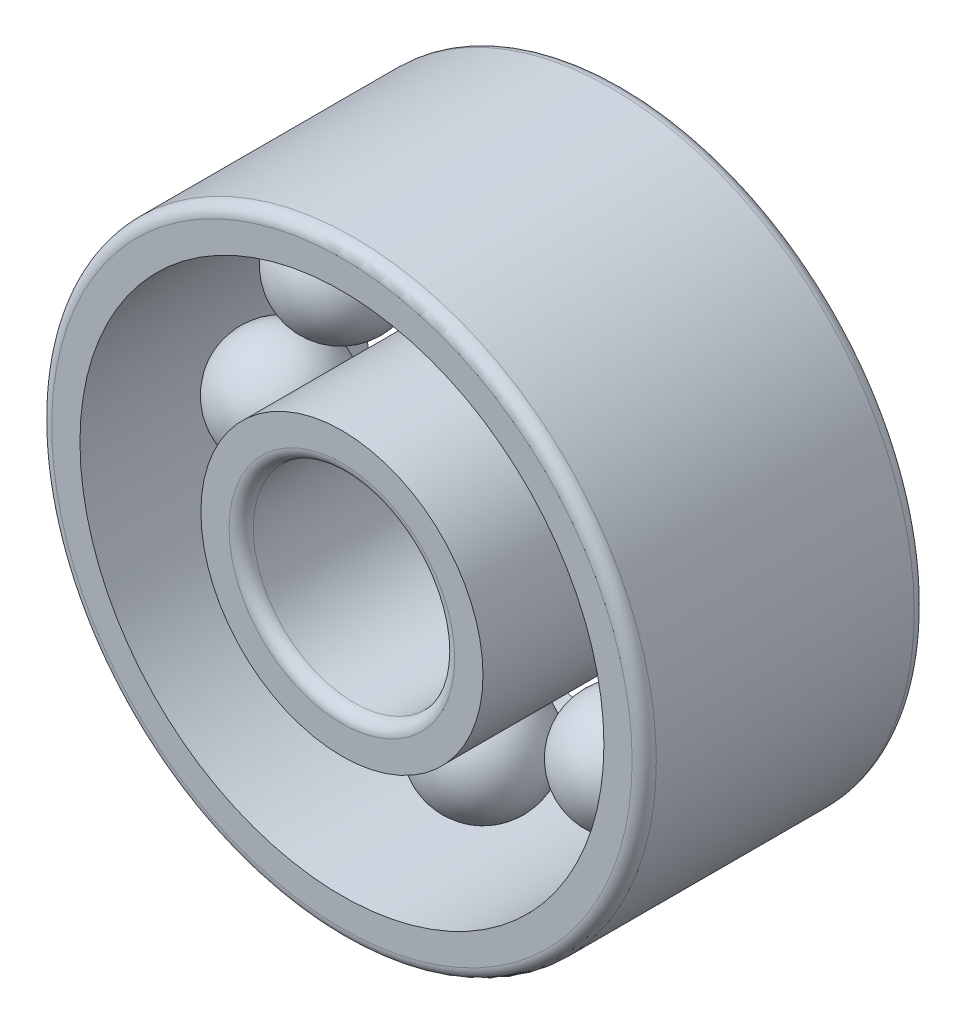
ISO-10303-21;
HEADER;
FILE_DESCRIPTION(('STEP AP214'),'2;1');
FILE_NAME('part.step','',(''),(''),'','','');
FILE_SCHEMA(('AUTOMOTIVE_DESIGN { 1 0 10303 214 1 1 1 1 }'));
ENDSEC;
DATA;
#1=APPLICATION_CONTEXT('core data for automotive mechanical design processes');
#2=APPLICATION_PROTOCOL_DEFINITION('international standard','automotive_design',2000,#1);
#3=PRODUCT_CONTEXT('',#1,'mechanical');
#4=PRODUCT('Part','Part','',(#3));
#5=PRODUCT_RELATED_PRODUCT_CATEGORY('part','',(#4));
#6=PRODUCT_DEFINITION_FORMATION('','',#4);
#7=PRODUCT_DEFINITION_CONTEXT('part definition',#1,'design');
#8=PRODUCT_DEFINITION('design','',#6,#7);
#9=PRODUCT_DEFINITION_SHAPE('','',#8);
#10=(LENGTH_UNIT() NAMED_UNIT(*) SI_UNIT(.MILLI.,.METRE.));
#11=(NAMED_UNIT(*) PLANE_ANGLE_UNIT() SI_UNIT($,.RADIAN.));
#12=(NAMED_UNIT(*) SI_UNIT($,.STERADIAN.) SOLID_ANGLE_UNIT());
#13=UNCERTAINTY_MEASURE_WITH_UNIT(LENGTH_MEASURE(1.E-05),#10,'distance_accuracy_value','');
#14=(GEOMETRIC_REPRESENTATION_CONTEXT(3) GLOBAL_UNCERTAINTY_ASSIGNED_CONTEXT((#13)) GLOBAL_UNIT_ASSIGNED_CONTEXT((#10,
#11,#12)) REPRESENTATION_CONTEXT('',''));
#15=CARTESIAN_POINT('',(0.,0.,0.));
#16=DIRECTION('',(0.,0.,1.));
#17=DIRECTION('',(1.,0.,0.));
#18=AXIS2_PLACEMENT_3D('',#15,#16,#17);
#19=CARTESIAN_POINT('',(7.07106781186547,-7.07106781186548,0.));
#20=DIRECTION('',(-0.707106781186547,0.707106781186548,0.));
#21=DIRECTION('',(0.,0.,-1.));
#22=AXIS2_PLACEMENT_3D('',#19,#20,#21);
#23=SPHERICAL_SURFACE('',#22,2.85);
#24=CARTESIAN_POINT('',(5.05581348548381,-5.05581348548382,0.));
#25=VERTEX_POINT('',#24);
#26=VERTEX_LOOP('',#25);
#27=FACE_BOUND('',#26,.T.);
#28=ADVANCED_FACE('F38',(#27),#23,.T.);
#29=CLOSED_SHELL('',(#28));
#30=MANIFOLD_SOLID_BREP('B2',#29);
#31=CARTESIAN_POINT('',(0.,-10.,0.));
#32=DIRECTION('',(0.,1.,0.));
#33=DIRECTION('',(0.,0.,-1.));
#34=AXIS2_PLACEMENT_3D('',#31,#32,#33);
#35=SPHERICAL_SURFACE('',#34,2.85);
#36=CARTESIAN_POINT('',(0.,-7.15,0.));
#37=VERTEX_POINT('',#36);
#38=VERTEX_LOOP('',#37);
#39=FACE_BOUND('',#38,.T.);
#40=ADVANCED_FACE('F57',(#39),#35,.T.);
#41=CLOSED_SHELL('',(#40));
#42=MANIFOLD_SOLID_BREP('B6',#41);
#43=CARTESIAN_POINT('',(-7.07106781186548,-7.07106781186547,0.));
#44=DIRECTION('',(0.707106781186548,0.707106781186547,0.));
#45=DIRECTION('',(0.,0.,-1.));
#46=AXIS2_PLACEMENT_3D('',#43,#44,#45);
#47=SPHERICAL_SURFACE('',#46,2.85);
#48=CARTESIAN_POINT('',(-5.05581348548382,-5.05581348548381,0.));
#49=VERTEX_POINT('',#48);
#50=VERTEX_LOOP('',#49);
#51=FACE_BOUND('',#50,.T.);
#52=ADVANCED_FACE('F76',(#51),#47,.T.);
#53=CLOSED_SHELL('',(#52));
#54=MANIFOLD_SOLID_BREP('B34',#53);
#55=CARTESIAN_POINT('',(-10.,0.,0.));
#56=DIRECTION('',(1.,0.,0.));
#57=DIRECTION('',(0.,0.,-1.));
#58=AXIS2_PLACEMENT_3D('',#55,#56,#57);
#59=SPHERICAL_SURFACE('',#58,2.85);
#60=CARTESIAN_POINT('',(-7.15,0.,0.));
#61=VERTEX_POINT('',#60);
#62=VERTEX_LOOP('',#61);
#63=FACE_BOUND('',#62,.T.);
#64=ADVANCED_FACE('F95',(#63),#59,.T.);
#65=CLOSED_SHELL('',(#64));
#66=MANIFOLD_SOLID_BREP('B53',#65);
#67=CARTESIAN_POINT('',(-7.07106781186547,7.07106781186548,0.));
#68=DIRECTION('',(0.707106781186547,-0.707106781186548,0.));
#69=DIRECTION('',(0.,0.,-1.));
#70=AXIS2_PLACEMENT_3D('',#67,#68,#69);
#71=SPHERICAL_SURFACE('',#70,2.85);
#72=CARTESIAN_POINT('',(-5.05581348548381,5.05581348548382,0.));
#73=VERTEX_POINT('',#72);
#74=VERTEX_LOOP('',#73);
#75=FACE_BOUND('',#74,.T.);
#76=ADVANCED_FACE('F114',(#75),#71,.T.);
#77=CLOSED_SHELL('',(#76));
#78=MANIFOLD_SOLID_BREP('B72',#77);
#79=CARTESIAN_POINT('',(0.,10.,0.));
#80=DIRECTION('',(0.,-1.,0.));
#81=DIRECTION('',(0.,0.,-1.));
#82=AXIS2_PLACEMENT_3D('',#79,#80,#81);
#83=SPHERICAL_SURFACE('',#82,2.85);
#84=CARTESIAN_POINT('',(0.,7.15,0.));
#85=VERTEX_POINT('',#84);
#86=VERTEX_LOOP('',#85);
#87=FACE_BOUND('',#86,.T.);
#88=ADVANCED_FACE('F133',(#87),#83,.T.);
#89=CLOSED_SHELL('',(#88));
#90=MANIFOLD_SOLID_BREP('B91',#89);
#91=CARTESIAN_POINT('',(7.07106781186548,7.07106781186548,0.));
#92=DIRECTION('',(-0.707106781186548,-0.707106781186548,0.));
#93=DIRECTION('',(0.,0.,-1.));
#94=AXIS2_PLACEMENT_3D('',#91,#92,#93);
#95=SPHERICAL_SURFACE('',#94,2.85);
#96=CARTESIAN_POINT('',(5.05581348548382,5.05581348548382,0.));
#97=VERTEX_POINT('',#96);
#98=VERTEX_LOOP('',#97);
#99=FACE_BOUND('',#98,.T.);
#100=ADVANCED_FACE('F152',(#99),#95,.T.);
#101=CLOSED_SHELL('',(#100));
#102=MANIFOLD_SOLID_BREP('B110',#101);
#103=CARTESIAN_POINT('',(10.,0.,0.));
#104=DIRECTION('',(-1.,0.,0.));
#105=DIRECTION('',(0.,0.,-1.));
#106=AXIS2_PLACEMENT_3D('',#103,#104,#105);
#107=SPHERICAL_SURFACE('',#106,2.85);
#108=CARTESIAN_POINT('',(7.15,0.,0.));
#109=VERTEX_POINT('',#108);
#110=VERTEX_LOOP('',#109);
#111=FACE_BOUND('',#110,.T.);
#112=ADVANCED_FACE('F173',(#111),#107,.T.);
#113=CLOSED_SHELL('',(#112));
#114=MANIFOLD_SOLID_BREP('B129',#113);
#115=CARTESIAN_POINT('',(0.,0.,11.5));
#116=DIRECTION('',(0.,0.,1.));
#117=DIRECTION('',(1.,0.,0.));
#118=AXIS2_PLACEMENT_3D('',#115,#116,#117);
#119=CYLINDRICAL_SURFACE('',#118,13.);
#120=CARTESIAN_POINT('',(0.,0.,7.));
#121=DIRECTION('',(0.,0.,1.));
#122=DIRECTION('',(1.,0.,0.));
#123=AXIS2_PLACEMENT_3D('',#120,#121,#122);
#124=CIRCLE('',#123,13.);
#125=CARTESIAN_POINT('',(13.,0.,7.));
#126=VERTEX_POINT('',#125);
#127=EDGE_CURVE('E213',#126,#126,#124,.T.);
#128=ORIENTED_EDGE('',*,*,#127,.T.);
#129=EDGE_LOOP('',(#128));
#130=FACE_BOUND('',#129,.T.);
#131=CARTESIAN_POINT('',(0.,0.,-7.));
#132=DIRECTION('',(0.,0.,1.));
#133=DIRECTION('',(1.,0.,0.));
#134=AXIS2_PLACEMENT_3D('',#131,#132,#133);
#135=CIRCLE('',#134,13.);
#136=CARTESIAN_POINT('',(13.,0.,-7.));
#137=VERTEX_POINT('',#136);
#138=EDGE_CURVE('E216',#137,#137,#135,.T.);
#139=ORIENTED_EDGE('',*,*,#138,.F.);
#140=EDGE_LOOP('',(#139));
#141=FACE_BOUND('',#140,.T.);
#142=ADVANCED_FACE('F193',(#130,#141),#119,.F.);
#143=CARTESIAN_POINT('',(13.,0.,7.));
#144=DIRECTION('',(0.,0.,1.));
#145=DIRECTION('',(1.,0.,0.));
#146=AXIS2_PLACEMENT_3D('',#143,#144,#145);
#147=PLANE('',#146);
#148=CARTESIAN_POINT('',(0.,0.,7.));
#149=DIRECTION('',(0.,0.,1.));
#150=DIRECTION('',(1.,0.,0.));
#151=AXIS2_PLACEMENT_3D('',#148,#149,#150);
#152=CIRCLE('',#151,14.4);
#153=CARTESIAN_POINT('',(14.4,0.,7.));
#154=VERTEX_POINT('',#153);
#155=EDGE_CURVE('E172',#154,#154,#152,.T.);
#156=ORIENTED_EDGE('',*,*,#155,.T.);
#157=EDGE_LOOP('',(#156));
#158=FACE_BOUND('',#157,.T.);
#159=ORIENTED_EDGE('',*,*,#127,.F.);
#160=EDGE_LOOP('',(#159));
#161=FACE_BOUND('',#160,.T.);
#162=ADVANCED_FACE('F223',(#158,#161),#147,.T.);
#163=CARTESIAN_POINT('',(0.,0.,11.5));
#164=DIRECTION('',(0.,0.,1.));
#165=DIRECTION('',(1.,0.,0.));
#166=AXIS2_PLACEMENT_3D('',#163,#164,#165);
#167=CYLINDRICAL_SURFACE('',#166,15.);
#168=CARTESIAN_POINT('',(0.,0.,-6.4));
#169=DIRECTION('',(0.,0.,-1.));
#170=DIRECTION('',(-1.,0.,0.));
#171=AXIS2_PLACEMENT_3D('',#168,#169,#170);
#172=CIRCLE('',#171,15.);
#173=CARTESIAN_POINT('',(-15.,0.,-6.4));
#174=VERTEX_POINT('',#173);
#175=EDGE_CURVE('E204',#174,#174,#172,.F.);
#176=ORIENTED_EDGE('',*,*,#175,.T.);
#177=EDGE_LOOP('',(#176));
#178=FACE_BOUND('',#177,.T.);
#179=CARTESIAN_POINT('',(0.,0.,6.4));
#180=DIRECTION('',(0.,0.,1.));
#181=DIRECTION('',(1.,0.,0.));
#182=AXIS2_PLACEMENT_3D('',#179,#180,#181);
#183=CIRCLE('',#182,15.);
#184=CARTESIAN_POINT('',(15.,0.,6.4));
#185=VERTEX_POINT('',#184);
#186=EDGE_CURVE('E208',#185,#185,#183,.F.);
#187=ORIENTED_EDGE('',*,*,#186,.T.);
#188=EDGE_LOOP('',(#187));
#189=FACE_BOUND('',#188,.T.);
#190=ADVANCED_FACE('F229',(#178,#189),#167,.T.);
#191=CARTESIAN_POINT('',(15.,0.,-7.));
#192=DIRECTION('',(0.,0.,-1.));
#193=DIRECTION('',(-1.,0.,0.));
#194=AXIS2_PLACEMENT_3D('',#191,#192,#193);
#195=PLANE('',#194);
#196=CARTESIAN_POINT('',(0.,0.,-7.));
#197=DIRECTION('',(0.,0.,-1.));
#198=DIRECTION('',(-1.,0.,0.));
#199=AXIS2_PLACEMENT_3D('',#196,#197,#198);
#200=CIRCLE('',#199,14.4);
#201=CARTESIAN_POINT('',(-14.4,0.,-7.));
#202=VERTEX_POINT('',#201);
#203=EDGE_CURVE('E200',#202,#202,#200,.T.);
#204=ORIENTED_EDGE('',*,*,#203,.T.);
#205=EDGE_LOOP('',(#204));
#206=FACE_BOUND('',#205,.T.);
#207=ORIENTED_EDGE('',*,*,#138,.T.);
#208=EDGE_LOOP('',(#207));
#209=FACE_BOUND('',#208,.T.);
#210=ADVANCED_FACE('F220',(#206,#209),#195,.T.);
#211=CARTESIAN_POINT('',(0.,0.,-6.4));
#212=DIRECTION('',(0.,0.,-1.));
#213=DIRECTION('',(-1.,0.,0.));
#214=AXIS2_PLACEMENT_3D('',#211,#212,#213);
#215=TOROIDAL_SURFACE('',#214,14.4,0.6);
#216=ORIENTED_EDGE('',*,*,#203,.F.);
#217=EDGE_LOOP('',(#216));
#218=FACE_BOUND('',#217,.T.);
#219=ORIENTED_EDGE('',*,*,#175,.F.);
#220=EDGE_LOOP('',(#219));
#221=FACE_BOUND('',#220,.T.);
#222=ADVANCED_FACE('F232',(#218,#221),#215,.T.);
#223=CARTESIAN_POINT('',(0.,0.,6.4));
#224=DIRECTION('',(0.,0.,1.));
#225=DIRECTION('',(1.,0.,0.));
#226=AXIS2_PLACEMENT_3D('',#223,#224,#225);
#227=TOROIDAL_SURFACE('',#226,14.4,0.6);
#228=ORIENTED_EDGE('',*,*,#186,.F.);
#229=EDGE_LOOP('',(#228));
#230=FACE_BOUND('',#229,.T.);
#231=ORIENTED_EDGE('',*,*,#155,.F.);
#232=EDGE_LOOP('',(#231));
#233=FACE_BOUND('',#232,.T.);
#234=ADVANCED_FACE('F195',(#230,#233),#227,.T.);
#235=CLOSED_SHELL('',(#142,#162,#190,#210,#222,#234));
#236=MANIFOLD_SOLID_BREP('B148',#235);
#237=CARTESIAN_POINT('',(0.,0.,11.5));
#238=DIRECTION('',(0.,0.,1.));
#239=DIRECTION('',(1.,0.,0.));
#240=AXIS2_PLACEMENT_3D('',#237,#238,#239);
#241=CYLINDRICAL_SURFACE('',#240,5.);
#242=CARTESIAN_POINT('',(0.,0.,-6.4));
#243=DIRECTION('',(0.,0.,-1.));
#244=DIRECTION('',(-1.,0.,0.));
#245=AXIS2_PLACEMENT_3D('',#242,#243,#244);
#246=CIRCLE('',#245,5.);
#247=CARTESIAN_POINT('',(-5.,0.,-6.4));
#248=VERTEX_POINT('',#247);
#249=EDGE_CURVE('E292',#248,#248,#246,.T.);
#250=ORIENTED_EDGE('',*,*,#249,.T.);
#251=EDGE_LOOP('',(#250));
#252=FACE_BOUND('',#251,.T.);
#253=CARTESIAN_POINT('',(0.,0.,6.4));
#254=DIRECTION('',(0.,0.,1.));
#255=DIRECTION('',(1.,0.,0.));
#256=AXIS2_PLACEMENT_3D('',#253,#254,#255);
#257=CIRCLE('',#256,5.);
#258=CARTESIAN_POINT('',(5.,0.,6.4));
#259=VERTEX_POINT('',#258);
#260=EDGE_CURVE('E296',#259,#259,#257,.T.);
#261=ORIENTED_EDGE('',*,*,#260,.T.);
#262=EDGE_LOOP('',(#261));
#263=FACE_BOUND('',#262,.T.);
#264=ADVANCED_FACE('F285',(#252,#263),#241,.F.);
#265=CARTESIAN_POINT('',(5.,0.,7.));
#266=DIRECTION('',(0.,0.,1.));
#267=DIRECTION('',(1.,0.,0.));
#268=AXIS2_PLACEMENT_3D('',#265,#266,#267);
#269=PLANE('',#268);
#270=CARTESIAN_POINT('',(0.,0.,7.));
#271=DIRECTION('',(0.,0.,1.));
#272=DIRECTION('',(1.,0.,0.));
#273=AXIS2_PLACEMENT_3D('',#270,#271,#272);
#274=CIRCLE('',#273,5.6);
#275=CARTESIAN_POINT('',(5.6,0.,7.));
#276=VERTEX_POINT('',#275);
#277=EDGE_CURVE('E192',#276,#276,#274,.F.);
#278=ORIENTED_EDGE('',*,*,#277,.T.);
#279=EDGE_LOOP('',(#278));
#280=FACE_BOUND('',#279,.T.);
#281=CARTESIAN_POINT('',(0.,0.,7.));
#282=DIRECTION('',(0.,0.,1.));
#283=DIRECTION('',(1.,0.,0.));
#284=AXIS2_PLACEMENT_3D('',#281,#282,#283);
#285=CIRCLE('',#284,7.);
#286=CARTESIAN_POINT('',(7.,0.,7.));
#287=VERTEX_POINT('',#286);
#288=EDGE_CURVE('E305',#287,#287,#285,.T.);
#289=ORIENTED_EDGE('',*,*,#288,.T.);
#290=EDGE_LOOP('',(#289));
#291=FACE_BOUND('',#290,.T.);
#292=ADVANCED_FACE('F325',(#280,#291),#269,.T.);
#293=CARTESIAN_POINT('',(0.,0.,11.5));
#294=DIRECTION('',(0.,0.,1.));
#295=DIRECTION('',(1.,0.,0.));
#296=AXIS2_PLACEMENT_3D('',#293,#294,#295);
#297=CYLINDRICAL_SURFACE('',#296,7.);
#298=CARTESIAN_POINT('',(0.,0.,-7.));
#299=DIRECTION('',(0.,0.,1.));
#300=DIRECTION('',(1.,0.,0.));
#301=AXIS2_PLACEMENT_3D('',#298,#299,#300);
#302=CIRCLE('',#301,7.);
#303=CARTESIAN_POINT('',(7.,0.,-7.));
#304=VERTEX_POINT('',#303);
#305=EDGE_CURVE('E308',#304,#304,#302,.T.);
#306=ORIENTED_EDGE('',*,*,#305,.T.);
#307=EDGE_LOOP('',(#306));
#308=FACE_BOUND('',#307,.T.);
#309=ORIENTED_EDGE('',*,*,#288,.F.);
#310=EDGE_LOOP('',(#309));
#311=FACE_BOUND('',#310,.T.);
#312=ADVANCED_FACE('F312',(#308,#311),#297,.T.);
#313=CARTESIAN_POINT('',(7.,0.,-7.));
#314=DIRECTION('',(0.,0.,-1.));
#315=DIRECTION('',(-1.,0.,0.));
#316=AXIS2_PLACEMENT_3D('',#313,#314,#315);
#317=PLANE('',#316);
#318=CARTESIAN_POINT('',(0.,0.,-7.));
#319=DIRECTION('',(0.,0.,-1.));
#320=DIRECTION('',(-1.,0.,0.));
#321=AXIS2_PLACEMENT_3D('',#318,#319,#320);
#322=CIRCLE('',#321,5.6);
#323=CARTESIAN_POINT('',(-5.6,0.,-7.));
#324=VERTEX_POINT('',#323);
#325=EDGE_CURVE('E300',#324,#324,#322,.F.);
#326=ORIENTED_EDGE('',*,*,#325,.T.);
#327=EDGE_LOOP('',(#326));
#328=FACE_BOUND('',#327,.T.);
#329=ORIENTED_EDGE('',*,*,#305,.F.);
#330=EDGE_LOOP('',(#329));
#331=FACE_BOUND('',#330,.T.);
#332=ADVANCED_FACE('F315',(#328,#331),#317,.T.);
#333=CARTESIAN_POINT('',(0.,0.,-6.4));
#334=DIRECTION('',(0.,0.,-1.));
#335=DIRECTION('',(-1.,0.,0.));
#336=AXIS2_PLACEMENT_3D('',#333,#334,#335);
#337=TOROIDAL_SURFACE('',#336,5.6,0.6);
#338=ORIENTED_EDGE('',*,*,#249,.F.);
#339=EDGE_LOOP('',(#338));
#340=FACE_BOUND('',#339,.T.);
#341=ORIENTED_EDGE('',*,*,#325,.F.);
#342=EDGE_LOOP('',(#341));
#343=FACE_BOUND('',#342,.T.);
#344=ADVANCED_FACE('F317',(#340,#343),#337,.T.);
#345=CARTESIAN_POINT('',(0.,0.,6.4));
#346=DIRECTION('',(0.,0.,1.));
#347=DIRECTION('',(1.,0.,0.));
#348=AXIS2_PLACEMENT_3D('',#345,#346,#347);
#349=TOROIDAL_SURFACE('',#348,5.6,0.6);
#350=ORIENTED_EDGE('',*,*,#277,.F.);
#351=EDGE_LOOP('',(#350));
#352=FACE_BOUND('',#351,.T.);
#353=ORIENTED_EDGE('',*,*,#260,.F.);
#354=EDGE_LOOP('',(#353));
#355=FACE_BOUND('',#354,.T.);
#356=ADVANCED_FACE('F287',(#352,#355),#349,.T.);
#357=CLOSED_SHELL('',(#264,#292,#312,#332,#344,#356));
#358=MANIFOLD_SOLID_BREP('B167',#357);
#359=ADVANCED_BREP_SHAPE_REPRESENTATION('',(#18,#30,#42,#54,#66,#78,#90,#102,#114,#236,#358),#14);
#360=SHAPE_DEFINITION_REPRESENTATION(#9,#359);
ENDSEC;
END-ISO-10303-21;
